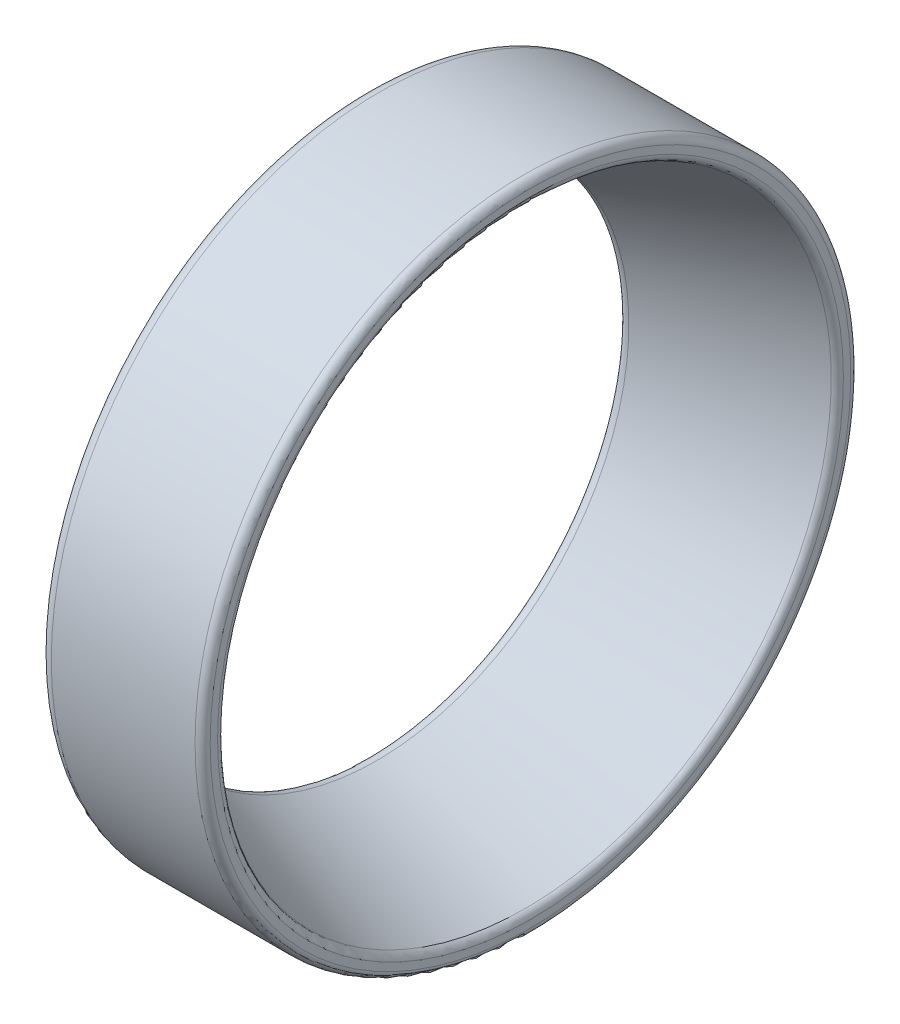
ISO-10303-21;
HEADER;
FILE_DESCRIPTION(('STEP AP214'),'2;1');
FILE_NAME('part.step','',(''),(''),'','','');
FILE_SCHEMA(('AUTOMOTIVE_DESIGN { 1 0 10303 214 1 1 1 1 }'));
ENDSEC;
DATA;
#1=APPLICATION_CONTEXT('core data for automotive mechanical design processes');
#2=APPLICATION_PROTOCOL_DEFINITION('international standard','automotive_design',2000,#1);
#3=PRODUCT_CONTEXT('',#1,'mechanical');
#4=PRODUCT('Part','Part','',(#3));
#5=PRODUCT_RELATED_PRODUCT_CATEGORY('part','',(#4));
#6=PRODUCT_DEFINITION_FORMATION('','',#4);
#7=PRODUCT_DEFINITION_CONTEXT('part definition',#1,'design');
#8=PRODUCT_DEFINITION('design','',#6,#7);
#9=PRODUCT_DEFINITION_SHAPE('','',#8);
#10=(LENGTH_UNIT() NAMED_UNIT(*) SI_UNIT(.MILLI.,.METRE.));
#11=(NAMED_UNIT(*) PLANE_ANGLE_UNIT() SI_UNIT($,.RADIAN.));
#12=(NAMED_UNIT(*) SI_UNIT($,.STERADIAN.) SOLID_ANGLE_UNIT());
#13=UNCERTAINTY_MEASURE_WITH_UNIT(LENGTH_MEASURE(1.E-05),#10,'distance_accuracy_value','');
#14=(GEOMETRIC_REPRESENTATION_CONTEXT(3) GLOBAL_UNCERTAINTY_ASSIGNED_CONTEXT((#13)) GLOBAL_UNIT_ASSIGNED_CONTEXT((#10,
#11,#12)) REPRESENTATION_CONTEXT('',''));
#15=CARTESIAN_POINT('',(0.,0.,0.));
#16=DIRECTION('',(0.,0.,1.));
#17=DIRECTION('',(1.,0.,0.));
#18=AXIS2_PLACEMENT_3D('',#15,#16,#17);
#19=CARTESIAN_POINT('',(-15.2963858502915,0.,0.));
#20=DIRECTION('',(-1.,0.,0.));
#21=DIRECTION('',(0.,0.,1.));
#22=AXIS2_PLACEMENT_3D('',#19,#20,#21);
#23=TOROIDAL_SURFACE('',#22,25.,1.);
#24=CARTESIAN_POINT('',(-16.2963858502915,0.,0.));
#25=DIRECTION('',(-1.,0.,0.));
#26=DIRECTION('',(0.,0.,1.));
#27=AXIS2_PLACEMENT_3D('',#24,#25,#26);
#28=CIRCLE('',#27,25.);
#29=CARTESIAN_POINT('',(-16.2963858502915,0.,25.));
#30=VERTEX_POINT('',#29);
#31=EDGE_CURVE('E10',#30,#30,#28,.T.);
#32=ORIENTED_EDGE('',*,*,#31,.F.);
#33=EDGE_LOOP('',(#32));
#34=FACE_BOUND('',#33,.T.);
#35=CARTESIAN_POINT('',(-15.2963858502915,0.,0.));
#36=DIRECTION('',(-1.,0.,0.));
#37=DIRECTION('',(0.,0.,1.));
#38=AXIS2_PLACEMENT_3D('',#35,#36,#37);
#39=CIRCLE('',#38,26.);
#40=CARTESIAN_POINT('',(-15.2963858502915,0.,26.));
#41=VERTEX_POINT('',#40);
#42=EDGE_CURVE('E59',#41,#41,#39,.T.);
#43=ORIENTED_EDGE('',*,*,#42,.T.);
#44=EDGE_LOOP('',(#43));
#45=FACE_BOUND('',#44,.T.);
#46=ADVANCED_FACE('F31',(#34,#45),#23,.T.);
#47=CARTESIAN_POINT('',(-16.2963858502915,20.5669450961475,0.));
#48=DIRECTION('',(1.,0.,0.));
#49=DIRECTION('',(0.,0.,-1.));
#50=AXIS2_PLACEMENT_3D('',#47,#48,#49);
#51=PLANE('',#50);
#52=CARTESIAN_POINT('',(-16.2963858502915,0.,0.));
#53=DIRECTION('',(-1.,0.,0.));
#54=DIRECTION('',(0.,0.,1.));
#55=AXIS2_PLACEMENT_3D('',#52,#53,#54);
#56=CIRCLE('',#55,20.5669450961475);
#57=CARTESIAN_POINT('',(-16.2963858502915,0.,20.5669450961475));
#58=VERTEX_POINT('',#57);
#59=EDGE_CURVE('E37',#58,#58,#56,.T.);
#60=ORIENTED_EDGE('',*,*,#59,.F.);
#61=EDGE_LOOP('',(#60));
#62=FACE_BOUND('',#61,.T.);
#63=ORIENTED_EDGE('',*,*,#31,.T.);
#64=EDGE_LOOP('',(#63));
#65=FACE_BOUND('',#64,.T.);
#66=ADVANCED_FACE('F96',(#62,#65),#51,.F.);
#67=CARTESIAN_POINT('',(-15.6963858502915,0.,0.));
#68=DIRECTION('',(-1.,0.,0.));
#69=DIRECTION('',(0.,0.,1.));
#70=AXIS2_PLACEMENT_3D('',#67,#68,#69);
#71=TOROIDAL_SURFACE('',#70,20.5669450961475,0.599999999999996);
#72=CARTESIAN_POINT('',(-15.4933210813297,0.,0.));
#73=DIRECTION('',(-1.,0.,0.));
#74=DIRECTION('',(0.,0.,1.));
#75=AXIS2_PLACEMENT_3D('',#72,#73,#74);
#76=CIRCLE('',#75,20.0023525885755);
#77=CARTESIAN_POINT('',(-15.4933210813297,0.,20.0023525885755));
#78=VERTEX_POINT('',#77);
#79=EDGE_CURVE('E41',#78,#78,#76,.T.);
#80=ORIENTED_EDGE('',*,*,#79,.F.);
#81=EDGE_LOOP('',(#80));
#82=FACE_BOUND('',#81,.T.);
#83=ORIENTED_EDGE('',*,*,#59,.T.);
#84=EDGE_LOOP('',(#83));
#85=FACE_BOUND('',#84,.T.);
#86=ADVANCED_FACE('F91',(#82,#85),#71,.T.);
#87=CARTESIAN_POINT('',(-15.4933210813297,0.,0.));
#88=DIRECTION('',(1.,0.,0.));
#89=DIRECTION('',(0.,0.,-1.));
#90=AXIS2_PLACEMENT_3D('',#87,#88,#89);
#91=CONICAL_SURFACE('',#90,20.0023525885755,0.345259932168382);
#92=CARTESIAN_POINT('',(-3.69332108132971,0.,0.));
#93=DIRECTION('',(-1.,0.,0.));
#94=DIRECTION('',(0.,0.,1.));
#95=AXIS2_PLACEMENT_3D('',#92,#93,#94);
#96=CIRCLE('',#95,24.246412227364);
#97=CARTESIAN_POINT('',(-3.69332108132971,0.,24.246412227364));
#98=VERTEX_POINT('',#97);
#99=EDGE_CURVE('E45',#98,#98,#96,.T.);
#100=ORIENTED_EDGE('',*,*,#99,.F.);
#101=EDGE_LOOP('',(#100));
#102=FACE_BOUND('',#101,.T.);
#103=ORIENTED_EDGE('',*,*,#79,.T.);
#104=EDGE_LOOP('',(#103));
#105=FACE_BOUND('',#104,.T.);
#106=ADVANCED_FACE('F85',(#102,#105),#91,.F.);
#107=CARTESIAN_POINT('',(-3.89638585029149,0.,0.));
#108=DIRECTION('',(-1.,0.,0.));
#109=DIRECTION('',(0.,0.,1.));
#110=AXIS2_PLACEMENT_3D('',#107,#108,#109);
#111=TOROIDAL_SURFACE('',#110,24.8110047349361,0.600000000000001);
#112=CARTESIAN_POINT('',(-3.29638585029149,0.,0.));
#113=DIRECTION('',(-1.,0.,0.));
#114=DIRECTION('',(0.,0.,1.));
#115=AXIS2_PLACEMENT_3D('',#112,#113,#114);
#116=CIRCLE('',#115,24.8110047349361);
#117=CARTESIAN_POINT('',(-3.29638585029149,0.,24.8110047349361));
#118=VERTEX_POINT('',#117);
#119=EDGE_CURVE('E50',#118,#118,#116,.T.);
#120=ORIENTED_EDGE('',*,*,#119,.F.);
#121=EDGE_LOOP('',(#120));
#122=FACE_BOUND('',#121,.T.);
#123=ORIENTED_EDGE('',*,*,#99,.T.);
#124=EDGE_LOOP('',(#123));
#125=FACE_BOUND('',#124,.T.);
#126=ADVANCED_FACE('F79',(#122,#125),#111,.T.);
#127=CARTESIAN_POINT('',(-3.29638585029149,25.4,0.));
#128=DIRECTION('',(-1.,0.,0.));
#129=DIRECTION('',(0.,0.,1.));
#130=AXIS2_PLACEMENT_3D('',#127,#128,#129);
#131=PLANE('',#130);
#132=CARTESIAN_POINT('',(-3.29638585029149,0.,0.));
#133=DIRECTION('',(-1.,0.,0.));
#134=DIRECTION('',(0.,0.,1.));
#135=AXIS2_PLACEMENT_3D('',#132,#133,#134);
#136=CIRCLE('',#135,25.4);
#137=CARTESIAN_POINT('',(-3.29638585029149,0.,25.4));
#138=VERTEX_POINT('',#137);
#139=EDGE_CURVE('E53',#138,#138,#136,.T.);
#140=ORIENTED_EDGE('',*,*,#139,.F.);
#141=EDGE_LOOP('',(#140));
#142=FACE_BOUND('',#141,.T.);
#143=ORIENTED_EDGE('',*,*,#119,.T.);
#144=EDGE_LOOP('',(#143));
#145=FACE_BOUND('',#144,.T.);
#146=ADVANCED_FACE('F73',(#142,#145),#131,.F.);
#147=CARTESIAN_POINT('',(-3.89638585029149,0.,0.));
#148=DIRECTION('',(-1.,0.,0.));
#149=DIRECTION('',(0.,0.,1.));
#150=AXIS2_PLACEMENT_3D('',#147,#148,#149);
#151=TOROIDAL_SURFACE('',#150,25.4,0.6);
#152=CARTESIAN_POINT('',(-3.89638585029149,0.,0.));
#153=DIRECTION('',(-1.,0.,0.));
#154=DIRECTION('',(0.,0.,1.));
#155=AXIS2_PLACEMENT_3D('',#152,#153,#154);
#156=CIRCLE('',#155,26.);
#157=CARTESIAN_POINT('',(-3.89638585029149,0.,26.));
#158=VERTEX_POINT('',#157);
#159=EDGE_CURVE('E56',#158,#158,#156,.T.);
#160=ORIENTED_EDGE('',*,*,#159,.F.);
#161=EDGE_LOOP('',(#160));
#162=FACE_BOUND('',#161,.T.);
#163=ORIENTED_EDGE('',*,*,#139,.T.);
#164=EDGE_LOOP('',(#163));
#165=FACE_BOUND('',#164,.T.);
#166=ADVANCED_FACE('F67',(#162,#165),#151,.T.);
#167=CARTESIAN_POINT('',(-17.9900567527011,0.,0.));
#168=DIRECTION('',(-1.,0.,0.));
#169=DIRECTION('',(0.,0.,1.));
#170=AXIS2_PLACEMENT_3D('',#167,#168,#169);
#171=CYLINDRICAL_SURFACE('',#170,26.);
#172=ORIENTED_EDGE('',*,*,#42,.F.);
#173=EDGE_LOOP('',(#172));
#174=FACE_BOUND('',#173,.T.);
#175=ORIENTED_EDGE('',*,*,#159,.T.);
#176=EDGE_LOOP('',(#175));
#177=FACE_BOUND('',#176,.T.);
#178=ADVANCED_FACE('F64',(#174,#177),#171,.T.);
#179=CLOSED_SHELL('',(#46,#66,#86,#106,#126,#146,#166,#178));
#180=MANIFOLD_SOLID_BREP('B2',#179);
#181=ADVANCED_BREP_SHAPE_REPRESENTATION('',(#18,#180),#14);
#182=SHAPE_DEFINITION_REPRESENTATION(#9,#181);
ENDSEC;
END-ISO-10303-21;
